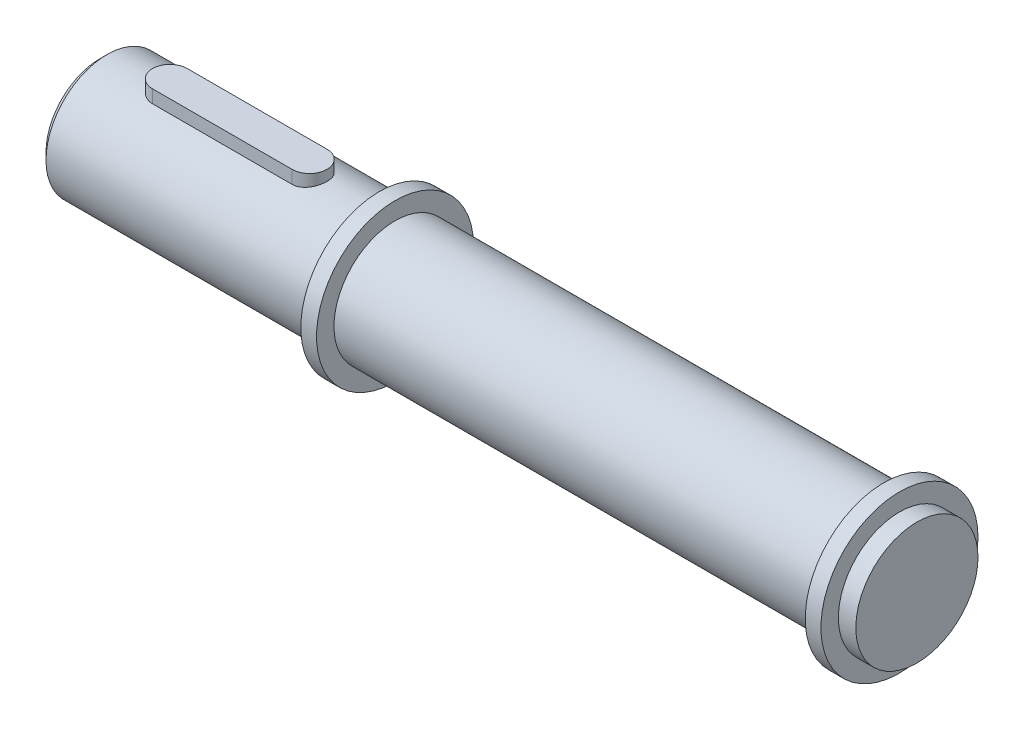
ISO-10303-21;
HEADER;
FILE_DESCRIPTION(('STEP AP214'),'2;1');
FILE_NAME('part.step','',(''),(''),'','','');
FILE_SCHEMA(('AUTOMOTIVE_DESIGN { 1 0 10303 214 1 1 1 1 }'));
ENDSEC;
DATA;
#1=APPLICATION_CONTEXT('core data for automotive mechanical design processes');
#2=APPLICATION_PROTOCOL_DEFINITION('international standard','automotive_design',2000,#1);
#3=PRODUCT_CONTEXT('',#1,'mechanical');
#4=PRODUCT('Part','Part','',(#3));
#5=PRODUCT_RELATED_PRODUCT_CATEGORY('part','',(#4));
#6=PRODUCT_DEFINITION_FORMATION('','',#4);
#7=PRODUCT_DEFINITION_CONTEXT('part definition',#1,'design');
#8=PRODUCT_DEFINITION('design','',#6,#7);
#9=PRODUCT_DEFINITION_SHAPE('','',#8);
#10=(LENGTH_UNIT() NAMED_UNIT(*) SI_UNIT(.MILLI.,.METRE.));
#11=(NAMED_UNIT(*) PLANE_ANGLE_UNIT() SI_UNIT($,.RADIAN.));
#12=(NAMED_UNIT(*) SI_UNIT($,.STERADIAN.) SOLID_ANGLE_UNIT());
#13=UNCERTAINTY_MEASURE_WITH_UNIT(LENGTH_MEASURE(1.E-05),#10,'distance_accuracy_value','');
#14=(GEOMETRIC_REPRESENTATION_CONTEXT(3) GLOBAL_UNCERTAINTY_ASSIGNED_CONTEXT((#13)) GLOBAL_UNIT_ASSIGNED_CONTEXT((#10,
#11,#12)) REPRESENTATION_CONTEXT('',''));
#15=CARTESIAN_POINT('',(0.,0.,0.));
#16=DIRECTION('',(0.,0.,1.));
#17=DIRECTION('',(1.,0.,0.));
#18=AXIS2_PLACEMENT_3D('',#15,#16,#17);
#19=CARTESIAN_POINT('',(-74.5,0.,0.));
#20=DIRECTION('',(1.,0.,0.));
#21=DIRECTION('',(0.,0.,-1.));
#22=AXIS2_PLACEMENT_3D('',#19,#20,#21);
#23=CYLINDRICAL_SURFACE('',#22,22.5);
#24=CARTESIAN_POINT('',(-74.5,0.,0.));
#25=DIRECTION('',(1.,0.,0.));
#26=DIRECTION('',(0.,0.,-1.));
#27=AXIS2_PLACEMENT_3D('',#24,#25,#26);
#28=CIRCLE('',#27,22.5);
#29=CARTESIAN_POINT('',(-74.5,0.,-22.5));
#30=VERTEX_POINT('',#29);
#31=EDGE_CURVE('E150',#30,#30,#28,.T.);
#32=ORIENTED_EDGE('',*,*,#31,.T.);
#33=EDGE_LOOP('',(#32));
#34=FACE_BOUND('',#33,.T.);
#35=CARTESIAN_POINT('',(-70.,0.,0.));
#36=DIRECTION('',(1.,0.,0.));
#37=DIRECTION('',(0.,0.,-1.));
#38=AXIS2_PLACEMENT_3D('',#35,#36,#37);
#39=CIRCLE('',#38,22.5);
#40=CARTESIAN_POINT('',(-70.,0.,-22.5));
#41=VERTEX_POINT('',#40);
#42=EDGE_CURVE('E147',#41,#41,#39,.T.);
#43=ORIENTED_EDGE('',*,*,#42,.F.);
#44=EDGE_LOOP('',(#43));
#45=FACE_BOUND('',#44,.T.);
#46=ADVANCED_FACE('F33',(#34,#45),#23,.T.);
#47=CARTESIAN_POINT('',(-74.5,22.5,0.));
#48=DIRECTION('',(-1.,0.,0.));
#49=DIRECTION('',(0.,0.,1.));
#50=AXIS2_PLACEMENT_3D('',#47,#48,#49);
#51=PLANE('',#50);
#52=CARTESIAN_POINT('',(-74.5,0.,0.));
#53=DIRECTION('',(-1.,0.,0.));
#54=DIRECTION('',(0.,0.,1.));
#55=AXIS2_PLACEMENT_3D('',#52,#53,#54);
#56=CIRCLE('',#55,17.5);
#57=CARTESIAN_POINT('',(-74.5,0.,17.5));
#58=VERTEX_POINT('',#57);
#59=EDGE_CURVE('E101',#58,#58,#56,.T.);
#60=ORIENTED_EDGE('',*,*,#59,.F.);
#61=EDGE_LOOP('',(#60));
#62=FACE_BOUND('',#61,.T.);
#63=ORIENTED_EDGE('',*,*,#31,.F.);
#64=EDGE_LOOP('',(#63));
#65=FACE_BOUND('',#64,.T.);
#66=ADVANCED_FACE('F186',(#62,#65),#51,.T.);
#67=CARTESIAN_POINT('',(74.5,0.,0.));
#68=DIRECTION('',(1.,0.,0.));
#69=DIRECTION('',(0.,0.,-1.));
#70=AXIS2_PLACEMENT_3D('',#67,#68,#69);
#71=PLANE('',#70);
#72=CARTESIAN_POINT('',(74.5,0.,0.));
#73=DIRECTION('',(1.,0.,0.));
#74=DIRECTION('',(0.,0.,-1.));
#75=AXIS2_PLACEMENT_3D('',#72,#73,#74);
#76=CIRCLE('',#75,17.5);
#77=CARTESIAN_POINT('',(74.5,0.,-17.5));
#78=VERTEX_POINT('',#77);
#79=EDGE_CURVE('E97',#78,#78,#76,.T.);
#80=ORIENTED_EDGE('',*,*,#79,.F.);
#81=EDGE_LOOP('',(#80));
#82=FACE_BOUND('',#81,.T.);
#83=CARTESIAN_POINT('',(74.5,0.,0.));
#84=DIRECTION('',(1.,0.,0.));
#85=DIRECTION('',(0.,0.,-1.));
#86=AXIS2_PLACEMENT_3D('',#83,#84,#85);
#87=CIRCLE('',#86,22.5);
#88=CARTESIAN_POINT('',(74.5,0.,-22.5));
#89=VERTEX_POINT('',#88);
#90=EDGE_CURVE('E162',#89,#89,#87,.T.);
#91=ORIENTED_EDGE('',*,*,#90,.T.);
#92=EDGE_LOOP('',(#91));
#93=FACE_BOUND('',#92,.T.);
#94=ADVANCED_FACE('F192',(#82,#93),#71,.T.);
#95=CARTESIAN_POINT('',(-74.5,0.,0.));
#96=DIRECTION('',(1.,0.,0.));
#97=DIRECTION('',(0.,0.,-1.));
#98=AXIS2_PLACEMENT_3D('',#95,#96,#97);
#99=CYLINDRICAL_SURFACE('',#98,22.5);
#100=CARTESIAN_POINT('',(70.,0.,0.));
#101=DIRECTION('',(1.,0.,0.));
#102=DIRECTION('',(0.,0.,-1.));
#103=AXIS2_PLACEMENT_3D('',#100,#101,#102);
#104=CIRCLE('',#103,22.5);
#105=CARTESIAN_POINT('',(70.,0.,-22.5));
#106=VERTEX_POINT('',#105);
#107=EDGE_CURVE('E159',#106,#106,#104,.T.);
#108=ORIENTED_EDGE('',*,*,#107,.T.);
#109=EDGE_LOOP('',(#108));
#110=FACE_BOUND('',#109,.T.);
#111=ORIENTED_EDGE('',*,*,#90,.F.);
#112=EDGE_LOOP('',(#111));
#113=FACE_BOUND('',#112,.T.);
#114=ADVANCED_FACE('F199',(#110,#113),#99,.T.);
#115=CARTESIAN_POINT('',(70.,22.5,0.));
#116=DIRECTION('',(-1.,0.,0.));
#117=DIRECTION('',(0.,0.,1.));
#118=AXIS2_PLACEMENT_3D('',#115,#116,#117);
#119=PLANE('',#118);
#120=CARTESIAN_POINT('',(70.,0.,0.));
#121=DIRECTION('',(1.,0.,0.));
#122=DIRECTION('',(0.,0.,-1.));
#123=AXIS2_PLACEMENT_3D('',#120,#121,#122);
#124=CIRCLE('',#123,17.5);
#125=CARTESIAN_POINT('',(70.,0.,-17.5));
#126=VERTEX_POINT('',#125);
#127=EDGE_CURVE('E156',#126,#126,#124,.T.);
#128=ORIENTED_EDGE('',*,*,#127,.T.);
#129=EDGE_LOOP('',(#128));
#130=FACE_BOUND('',#129,.T.);
#131=ORIENTED_EDGE('',*,*,#107,.F.);
#132=EDGE_LOOP('',(#131));
#133=FACE_BOUND('',#132,.T.);
#134=ADVANCED_FACE('F203',(#130,#133),#119,.T.);
#135=CARTESIAN_POINT('',(-74.5,0.,0.));
#136=DIRECTION('',(1.,0.,0.));
#137=DIRECTION('',(0.,0.,-1.));
#138=AXIS2_PLACEMENT_3D('',#135,#136,#137);
#139=CYLINDRICAL_SURFACE('',#138,17.5);
#140=CARTESIAN_POINT('',(-70.,0.,0.));
#141=DIRECTION('',(1.,0.,0.));
#142=DIRECTION('',(0.,0.,-1.));
#143=AXIS2_PLACEMENT_3D('',#140,#141,#142);
#144=CIRCLE('',#143,17.5);
#145=CARTESIAN_POINT('',(-70.,0.,-17.5));
#146=VERTEX_POINT('',#145);
#147=EDGE_CURVE('E153',#146,#146,#144,.T.);
#148=ORIENTED_EDGE('',*,*,#147,.T.);
#149=EDGE_LOOP('',(#148));
#150=FACE_BOUND('',#149,.T.);
#151=ORIENTED_EDGE('',*,*,#127,.F.);
#152=EDGE_LOOP('',(#151));
#153=FACE_BOUND('',#152,.T.);
#154=ADVANCED_FACE('F207',(#150,#153),#139,.T.);
#155=CARTESIAN_POINT('',(-70.,17.5,0.));
#156=DIRECTION('',(1.,0.,0.));
#157=DIRECTION('',(0.,0.,-1.));
#158=AXIS2_PLACEMENT_3D('',#155,#156,#157);
#159=PLANE('',#158);
#160=ORIENTED_EDGE('',*,*,#42,.T.);
#161=EDGE_LOOP('',(#160));
#162=FACE_BOUND('',#161,.T.);
#163=ORIENTED_EDGE('',*,*,#147,.F.);
#164=EDGE_LOOP('',(#163));
#165=FACE_BOUND('',#164,.T.);
#166=ADVANCED_FACE('F211',(#162,#165),#159,.T.);
#167=CARTESIAN_POINT('',(-154.5,0.,0.));
#168=DIRECTION('',(1.,0.,0.));
#169=DIRECTION('',(0.,0.,-1.));
#170=AXIS2_PLACEMENT_3D('',#167,#168,#169);
#171=CYLINDRICAL_SURFACE('',#170,17.5);
#172=CARTESIAN_POINT('',(-152.499999999995,0.,0.));
#173=DIRECTION('',(-1.,0.,0.));
#174=DIRECTION('',(0.,0.,1.));
#175=AXIS2_PLACEMENT_3D('',#172,#173,#174);
#176=CIRCLE('',#175,17.5);
#177=CARTESIAN_POINT('',(-152.499999999995,0.,17.5));
#178=VERTEX_POINT('',#177);
#179=EDGE_CURVE('E11',#178,#178,#176,.F.);
#180=ORIENTED_EDGE('',*,*,#179,.T.);
#181=EDGE_LOOP('',(#180));
#182=FACE_BOUND('',#181,.T.);
#183=DIRECTION('',(1.,0.,0.));
#184=VECTOR('',#183,1.);
#185=CARTESIAN_POINT('',(-154.5,16.7705098312484,5.));
#186=LINE('',#185,#184);
#187=CARTESIAN_POINT('',(-134.5,16.7705098312467,5.));
#188=VERTEX_POINT('',#187);
#189=CARTESIAN_POINT('',(-94.5,16.7705098312484,5.));
#190=VERTEX_POINT('',#189);
#191=EDGE_CURVE('E129',#188,#190,#186,.T.);
#192=ORIENTED_EDGE('',*,*,#191,.F.);
#193=CARTESIAN_POINT('',(-134.5,16.7705098312484,-5.));
#194=CARTESIAN_POINT('',(-134.637543766947,16.7704912725158,-5.00001814544053));
#195=CARTESIAN_POINT('',(-134.775080622023,16.7722013219269,-4.99432529208164));
#196=CARTESIAN_POINT('',(-135.049111189284,16.7789431019967,-4.97165222541634));
#197=CARTESIAN_POINT('',(-135.185605111843,16.7839741438635,-4.95467435267923));
#198=CARTESIAN_POINT('',(-135.456258454019,16.7972068372471,-4.90961903685605));
#199=CARTESIAN_POINT('',(-135.590422624833,16.8054009743523,-4.8815678964473));
#200=CARTESIAN_POINT('',(-135.855799641989,16.8247046364186,-4.81461674604718));
#201=CARTESIAN_POINT('',(-135.987012422422,16.8358142264156,-4.77571649404059));
#202=CARTESIAN_POINT('',(-136.245531660622,16.8606149796878,-4.68740449021954));
#203=CARTESIAN_POINT('',(-136.372840055364,16.874304837985,-4.63799805032665));
#204=CARTESIAN_POINT('',(-136.622799362726,16.9038705765848,-4.5290552200171));
#205=CARTESIAN_POINT('',(-136.745448523371,16.9197472690052,-4.46951506432956));
#206=CARTESIAN_POINT('',(-137.105208360307,16.9699997678901,-4.27631278448766));
#207=CARTESIAN_POINT('',(-137.334298361895,17.007014905076,-4.12801150136262));
#208=CARTESIAN_POINT('',(-137.770513964869,17.0850471293107,-3.79229915782692));
#209=CARTESIAN_POINT('',(-137.976920274657,17.1261428352533,-3.60397767000145));
#210=CARTESIAN_POINT('',(-138.355737693074,17.2070462516998,-3.19544341696383));
#211=CARTESIAN_POINT('',(-138.528143164041,17.2468537476932,-2.97522537348192));
#212=CARTESIAN_POINT('',(-138.837078091968,17.3215844019062,-2.50410851659381));
#213=CARTESIAN_POINT('',(-138.972880924298,17.3564029869975,-2.25271539483175));
#214=CARTESIAN_POINT('',(-139.200007712392,17.4163145657263,-1.72950937060038));
#215=CARTESIAN_POINT('',(-139.291342305188,17.4414098849257,-1.45770136944962));
#216=CARTESIAN_POINT('',(-139.424585700851,17.4784878135792,-0.908899275051315));
#217=CARTESIAN_POINT('',(-139.46772185459,17.4907954521753,-0.632225504452082));
#218=CARTESIAN_POINT('',(-139.507216694155,17.5020523750682,-0.0753060921048481));
#219=CARTESIAN_POINT('',(-139.503583330996,17.5010039299559,0.204938934421961));
#220=CARTESIAN_POINT('',(-139.450484519806,17.4859002467781,0.7524513735302));
#221=CARTESIAN_POINT('',(-139.402347600726,17.4722220494947,1.01985970934148));
#222=CARTESIAN_POINT('',(-139.263759170452,17.433846479088,1.5426351469282));
#223=CARTESIAN_POINT('',(-139.17330552299,17.4091485496606,1.79800164008104));
#224=CARTESIAN_POINT('',(-138.951733628734,17.3509771517082,2.29267928834746));
#225=CARTESIAN_POINT('',(-138.820181047918,17.3174105731756,2.53178407311226));
#226=CARTESIAN_POINT('',(-138.520355666425,17.2450626129451,2.98504901208546));
#227=CARTESIAN_POINT('',(-138.352075412724,17.2062801734237,3.19920408978385));
#228=CARTESIAN_POINT('',(-138.072372641175,17.1465202223136,3.50113424709604));
#229=CARTESIAN_POINT('',(-137.972636135654,17.1259700648702,3.60007423743549));
#230=CARTESIAN_POINT('',(-137.76517975766,17.0851123940087,3.7892313461309));
#231=CARTESIAN_POINT('',(-137.65746266013,17.0648047990745,3.87945147156873));
#232=CARTESIAN_POINT('',(-137.434654959007,17.0249868857383,4.05062437518906));
#233=CARTESIAN_POINT('',(-137.319559470128,17.005477109874,4.13157091233147));
#234=CARTESIAN_POINT('',(-137.082839206299,16.9678346429649,4.28353981460234));
#235=CARTESIAN_POINT('',(-136.961216996666,16.9497014175386,4.35456603991597));
#236=CARTESIAN_POINT('',(-136.711084048682,16.9151829895462,4.48679157824972));
#237=CARTESIAN_POINT('',(-136.582521372203,16.898814896638,4.54789718496758));
#238=CARTESIAN_POINT('',(-136.32045850364,16.8685251216221,4.65898872141543));
#239=CARTESIAN_POINT('',(-136.186960342239,16.8546024466245,4.70897916633161));
#240=CARTESIAN_POINT('',(-135.916078988644,16.829649854127,4.79739484975373));
#241=CARTESIAN_POINT('',(-135.778700020741,16.8186169160755,4.835832170633));
#242=CARTESIAN_POINT('',(-135.501004454348,16.7997865631929,4.90084834749728));
#243=CARTESIAN_POINT('',(-135.360689248481,16.7919876494693,4.92743269748004));
#244=CARTESIAN_POINT('',(-135.100334885787,16.7808301521248,4.96528740578586));
#245=CARTESIAN_POINT('',(-134.980568370272,16.776966894118,4.97830600651658));
#246=CARTESIAN_POINT('',(-134.740537705184,16.7718034889731,4.99566040544727));
#247=CARTESIAN_POINT('',(-134.620274596223,16.7704994326599,5.00000944654161));
#248=CARTESIAN_POINT('',(-134.5,16.7705098312484,5.));
#249=B_SPLINE_CURVE_WITH_KNOTS('',3,(#193,#194,#195,#196,#197,#198,#199,#200,#201,#202,#203,
#204,#205,#206,#207,#208,#209,#210,#211,#212,#213,#214,#215,#216,#217,#218,#219,#220,#221,#222,
#223,#224,#225,#226,#227,#228,#229,#230,#231,#232,#233,#234,#235,#236,#237,#238,#239,#240,#241,
#242,#243,#244,#245,#246,#247,#248),.UNSPECIFIED.,.F.,.F.,(4,2,2,2,2,2,2,2,2,2,2,2,2,2,2,2,2,2,
2,2,2,2,2,2,2,2,2,4),(0.,0.41249217880454,0.824898831357961,1.2363317198125,1.64777378699038,
2.05900832185037,2.47039598941258,3.29264569343989,4.13611232627187,4.97971869650209,
5.83900986868946,6.69809539287325,7.53476732988531,8.37129703101928,9.18363381655587,
9.99601161556284,10.8172828992968,11.6387209961027,12.0642579015972,12.489647531354,
12.9153217832843,13.3408299328975,13.7701489130554,14.1992931759112,14.6279870611799,
15.056482034464,15.4177510461265,15.7784677892953),.UNSPECIFIED.);
#250=CARTESIAN_POINT('',(-134.5,16.7705098312467,-5.));
#251=VERTEX_POINT('',#250);
#252=EDGE_CURVE('E56',#251,#188,#249,.T.);
#253=ORIENTED_EDGE('',*,*,#252,.F.);
#254=DIRECTION('',(1.,0.,0.));
#255=VECTOR('',#254,1.);
#256=CARTESIAN_POINT('',(-154.5,16.7705098312484,-5.));
#257=LINE('',#256,#255);
#258=CARTESIAN_POINT('',(-94.5,16.7705098312484,-5.));
#259=VERTEX_POINT('',#258);
#260=EDGE_CURVE('E120',#259,#251,#257,.F.);
#261=ORIENTED_EDGE('',*,*,#260,.F.);
#262=CARTESIAN_POINT('',(-94.5,16.7705098312484,5.));
#263=CARTESIAN_POINT('',(-94.3624562330531,16.7704912725158,5.00001814544053));
#264=CARTESIAN_POINT('',(-94.2249193779771,16.7722013219269,4.99432529208164));
#265=CARTESIAN_POINT('',(-93.9508888107155,16.7789431019967,4.97165222541634));
#266=CARTESIAN_POINT('',(-93.8143948881572,16.7839741438635,4.95467435267923));
#267=CARTESIAN_POINT('',(-93.5437415459805,16.7972068372471,4.90961903685605));
#268=CARTESIAN_POINT('',(-93.4095773751666,16.8054009743523,4.88156789644729));
#269=CARTESIAN_POINT('',(-93.1442003580112,16.8247046364186,4.81461674604718));
#270=CARTESIAN_POINT('',(-93.012987577578,16.8358142264156,4.77571649404058));
#271=CARTESIAN_POINT('',(-92.7544683393777,16.8606149796878,4.68740449021953));
#272=CARTESIAN_POINT('',(-92.6271599446359,16.874304837985,4.63799805032664));
#273=CARTESIAN_POINT('',(-92.3772006372743,16.9038705765848,4.52905522001708));
#274=CARTESIAN_POINT('',(-92.2545514766285,16.9197472690052,4.46951506432954));
#275=CARTESIAN_POINT('',(-91.894791639693,16.9699997678901,4.27631278448764));
#276=CARTESIAN_POINT('',(-91.6657016381045,17.007014905076,4.12801150136261));
#277=CARTESIAN_POINT('',(-91.2294860351306,17.0850471293107,3.79229915782691));
#278=CARTESIAN_POINT('',(-91.023079725343,17.1261428352533,3.60397767000144));
#279=CARTESIAN_POINT('',(-90.6442623069264,17.2070462516998,3.19544341696382));
#280=CARTESIAN_POINT('',(-90.471856835959,17.2468537476932,2.97522537348191));
#281=CARTESIAN_POINT('',(-90.1629219080325,17.3215844019063,2.5041085165938));
#282=CARTESIAN_POINT('',(-90.0271190757015,17.3564029869975,2.25271539483174));
#283=CARTESIAN_POINT('',(-89.7999922876077,17.4163145657263,1.72950937060037));
#284=CARTESIAN_POINT('',(-89.7086576948119,17.4414098849257,1.45770136944961));
#285=CARTESIAN_POINT('',(-89.5754142991493,17.4784878135793,0.908899275051307));
#286=CARTESIAN_POINT('',(-89.5322781454103,17.4907954521753,0.632225504452075));
#287=CARTESIAN_POINT('',(-89.4927833058454,17.5020523750682,0.0753060921048373));
#288=CARTESIAN_POINT('',(-89.4964166690043,17.5010039299558,-0.204938934421976));
#289=CARTESIAN_POINT('',(-89.5495154801944,17.4859002467781,-0.752451373530218));
#290=CARTESIAN_POINT('',(-89.5976523992742,17.4722220494947,-1.0198597093415));
#291=CARTESIAN_POINT('',(-89.7362408295484,17.433846479088,-1.54263514692821));
#292=CARTESIAN_POINT('',(-89.8266944770104,17.4091485496606,-1.79800164008106));
#293=CARTESIAN_POINT('',(-90.0482663712656,17.3509771517082,-2.29267928834748));
#294=CARTESIAN_POINT('',(-90.1798189520825,17.3174105731756,-2.53178407311227));
#295=CARTESIAN_POINT('',(-90.4796443335755,17.2450626129451,-2.98504901208547));
#296=CARTESIAN_POINT('',(-90.6479245872765,17.2062801734237,-3.19920408978386));
#297=CARTESIAN_POINT('',(-90.9276273588245,17.1465202223136,-3.50113424709606));
#298=CARTESIAN_POINT('',(-91.0273638643464,17.1259700648702,-3.60007423743551));
#299=CARTESIAN_POINT('',(-91.2348202423399,17.0851123940087,-3.7892313461309));
#300=CARTESIAN_POINT('',(-91.3425373398701,17.0648047990745,-3.87945147156872));
#301=CARTESIAN_POINT('',(-91.5653450409931,17.0249868857383,-4.05062437518905));
#302=CARTESIAN_POINT('',(-91.6804405298721,17.005477109874,-4.13157091233147));
#303=CARTESIAN_POINT('',(-91.9171607937009,16.9678346429649,-4.28353981460234));
#304=CARTESIAN_POINT('',(-92.0387830033338,16.9497014175386,-4.35456603991597));
#305=CARTESIAN_POINT('',(-92.2889159513182,16.9151829895461,-4.48679157824972));
#306=CARTESIAN_POINT('',(-92.4174786277971,16.898814896638,-4.5478971849676));
#307=CARTESIAN_POINT('',(-92.67954149636,16.8685251216221,-4.65898872141545));
#308=CARTESIAN_POINT('',(-92.8130396577613,16.8546024466245,-4.70897916633163));
#309=CARTESIAN_POINT('',(-93.0839210113563,16.829649854127,-4.79739484975374));
#310=CARTESIAN_POINT('',(-93.2212999792591,16.8186169160755,-4.83583217063301));
#311=CARTESIAN_POINT('',(-93.4989955456524,16.7997865631929,-4.90084834749729));
#312=CARTESIAN_POINT('',(-93.6393107515193,16.7919876494693,-4.92743269748005));
#313=CARTESIAN_POINT('',(-93.8996651142126,16.7808301521248,-4.96528740578587));
#314=CARTESIAN_POINT('',(-94.0194316297284,16.776966894118,-4.97830600651658));
#315=CARTESIAN_POINT('',(-94.2594622948156,16.7718034889731,-4.99566040544728));
#316=CARTESIAN_POINT('',(-94.379725403777,16.7704994326599,-5.00000944654161));
#317=CARTESIAN_POINT('',(-94.5,16.7705098312484,-5.));
#318=B_SPLINE_CURVE_WITH_KNOTS('',3,(#262,#263,#264,#265,#266,#267,#268,#269,#270,#271,#272,
#273,#274,#275,#276,#277,#278,#279,#280,#281,#282,#283,#284,#285,#286,#287,#288,#289,#290,#291,
#292,#293,#294,#295,#296,#297,#298,#299,#300,#301,#302,#303,#304,#305,#306,#307,#308,#309,#310,
#311,#312,#313,#314,#315,#316,#317),.UNSPECIFIED.,.F.,.F.,(4,2,2,2,2,2,2,2,2,2,2,2,2,2,2,2,2,2,
2,2,2,2,2,2,2,2,2,4),(0.,0.412492178804554,0.824898831357989,1.23633171981253,1.64777378699039,
2.05900832185038,2.47039598941263,3.29264569343992,4.13611232627188,4.9797186965021,
5.83900986868948,6.69809539287325,7.53476732988531,8.3712970310193,9.18363381655588,
9.99601161556284,10.8172828992968,11.6387209961027,12.0642579015972,12.489647531354,
12.9153217832843,13.3408299328975,13.7701489130555,14.1992931759112,14.6279870611799,
15.056482034464,15.4177510461265,15.7784677892953),.UNSPECIFIED.);
#319=EDGE_CURVE('E122',#190,#259,#318,.T.);
#320=ORIENTED_EDGE('',*,*,#319,.F.);
#321=EDGE_LOOP('',(#192,#253,#261,#320));
#322=FACE_BOUND('',#321,.T.);
#323=ORIENTED_EDGE('',*,*,#59,.T.);
#324=EDGE_LOOP('',(#323));
#325=FACE_BOUND('',#324,.T.);
#326=ADVANCED_FACE('F214',(#182,#322,#325),#171,.T.);
#327=CARTESIAN_POINT('',(-154.5,0.,0.));
#328=DIRECTION('',(-1.,0.,0.));
#329=DIRECTION('',(0.,0.,1.));
#330=AXIS2_PLACEMENT_3D('',#327,#328,#329);
#331=PLANE('',#330);
#332=CARTESIAN_POINT('',(-154.5,0.,0.));
#333=DIRECTION('',(-1.,0.,0.));
#334=DIRECTION('',(0.,0.,1.));
#335=AXIS2_PLACEMENT_3D('',#332,#333,#334);
#336=CIRCLE('',#335,15.5000000000051);
#337=CARTESIAN_POINT('',(-154.5,0.,15.5000000000051));
#338=VERTEX_POINT('',#337);
#339=EDGE_CURVE('E41',#338,#338,#336,.T.);
#340=ORIENTED_EDGE('',*,*,#339,.T.);
#341=EDGE_LOOP('',(#340));
#342=FACE_BOUND('',#341,.T.);
#343=CARTESIAN_POINT('',(-154.5,0.,0.));
#344=DIRECTION('',(-1.,0.,0.));
#345=DIRECTION('',(0.,0.,1.));
#346=AXIS2_PLACEMENT_3D('',#343,#344,#345);
#347=CIRCLE('',#346,9.05000000000644);
#348=CARTESIAN_POINT('',(-154.5,0.,9.05000000000644));
#349=VERTEX_POINT('',#348);
#350=EDGE_CURVE('E169',#349,#349,#347,.F.);
#351=ORIENTED_EDGE('',*,*,#350,.T.);
#352=EDGE_LOOP('',(#351));
#353=FACE_BOUND('',#352,.T.);
#354=ADVANCED_FACE('F140',(#342,#353),#331,.T.);
#355=CARTESIAN_POINT('',(-134.5,-500000.,0.));
#356=DIRECTION('',(0.,1.,0.));
#357=DIRECTION('',(0.,0.,1.));
#358=AXIS2_PLACEMENT_3D('',#355,#356,#357);
#359=CYLINDRICAL_SURFACE('',#358,5.);
#360=DIRECTION('',(0.,1.,0.));
#361=VECTOR('',#360,1.);
#362=CARTESIAN_POINT('',(-134.5,-500000.,-5.));
#363=LINE('',#362,#361);
#364=CARTESIAN_POINT('',(-134.5,20.5,-5.));
#365=VERTEX_POINT('',#364);
#366=EDGE_CURVE('E111',#251,#365,#363,.T.);
#367=ORIENTED_EDGE('',*,*,#366,.F.);
#368=ORIENTED_EDGE('',*,*,#252,.T.);
#369=DIRECTION('',(0.,1.,0.));
#370=VECTOR('',#369,1.);
#371=CARTESIAN_POINT('',(-134.5,-500000.,5.));
#372=LINE('',#371,#370);
#373=CARTESIAN_POINT('',(-134.5,20.5,5.));
#374=VERTEX_POINT('',#373);
#375=EDGE_CURVE('E118',#188,#374,#372,.T.);
#376=ORIENTED_EDGE('',*,*,#375,.T.);
#377=CARTESIAN_POINT('',(-134.5,20.5,0.));
#378=DIRECTION('',(0.,1.,0.));
#379=DIRECTION('',(0.,0.,1.));
#380=AXIS2_PLACEMENT_3D('',#377,#378,#379);
#381=CIRCLE('',#380,5.);
#382=EDGE_CURVE('E90',#365,#374,#381,.T.);
#383=ORIENTED_EDGE('',*,*,#382,.F.);
#384=EDGE_LOOP('',(#367,#368,#376,#383));
#385=FACE_BOUND('',#384,.T.);
#386=ADVANCED_FACE('F138',(#385),#359,.T.);
#387=CARTESIAN_POINT('',(-134.5,-500000.,5.));
#388=DIRECTION('',(0.,0.,1.));
#389=DIRECTION('',(1.,0.,0.));
#390=AXIS2_PLACEMENT_3D('',#387,#388,#389);
#391=PLANE('',#390);
#392=ORIENTED_EDGE('',*,*,#375,.F.);
#393=ORIENTED_EDGE('',*,*,#191,.T.);
#394=DIRECTION('',(0.,1.,0.));
#395=VECTOR('',#394,1.);
#396=CARTESIAN_POINT('',(-94.5,-500000.,5.));
#397=LINE('',#396,#395);
#398=CARTESIAN_POINT('',(-94.5,20.5,5.));
#399=VERTEX_POINT('',#398);
#400=EDGE_CURVE('E116',#190,#399,#397,.T.);
#401=ORIENTED_EDGE('',*,*,#400,.T.);
#402=DIRECTION('',(1.,0.,0.));
#403=VECTOR('',#402,1.);
#404=CARTESIAN_POINT('',(-134.5,20.5,5.));
#405=LINE('',#404,#403);
#406=EDGE_CURVE('E102',#374,#399,#405,.T.);
#407=ORIENTED_EDGE('',*,*,#406,.F.);
#408=EDGE_LOOP('',(#392,#393,#401,#407));
#409=FACE_BOUND('',#408,.T.);
#410=ADVANCED_FACE('F232',(#409),#391,.T.);
#411=CARTESIAN_POINT('',(-94.5,-500000.,0.));
#412=DIRECTION('',(0.,1.,0.));
#413=DIRECTION('',(0.,0.,1.));
#414=AXIS2_PLACEMENT_3D('',#411,#412,#413);
#415=CYLINDRICAL_SURFACE('',#414,5.);
#416=ORIENTED_EDGE('',*,*,#400,.F.);
#417=ORIENTED_EDGE('',*,*,#319,.T.);
#418=DIRECTION('',(0.,1.,0.));
#419=VECTOR('',#418,1.);
#420=CARTESIAN_POINT('',(-94.5,-500000.,-5.));
#421=LINE('',#420,#419);
#422=CARTESIAN_POINT('',(-94.5,20.5,-5.));
#423=VERTEX_POINT('',#422);
#424=EDGE_CURVE('E48',#259,#423,#421,.T.);
#425=ORIENTED_EDGE('',*,*,#424,.T.);
#426=CARTESIAN_POINT('',(-94.5,20.5,0.));
#427=DIRECTION('',(0.,1.,0.));
#428=DIRECTION('',(0.,0.,1.));
#429=AXIS2_PLACEMENT_3D('',#426,#427,#428);
#430=CIRCLE('',#429,5.);
#431=EDGE_CURVE('E105',#399,#423,#430,.T.);
#432=ORIENTED_EDGE('',*,*,#431,.F.);
#433=EDGE_LOOP('',(#416,#417,#425,#432));
#434=FACE_BOUND('',#433,.T.);
#435=ADVANCED_FACE('F131',(#434),#415,.T.);
#436=CARTESIAN_POINT('',(-94.5,-500000.,-5.));
#437=DIRECTION('',(0.,0.,-1.));
#438=DIRECTION('',(-1.,0.,0.));
#439=AXIS2_PLACEMENT_3D('',#436,#437,#438);
#440=PLANE('',#439);
#441=ORIENTED_EDGE('',*,*,#424,.F.);
#442=ORIENTED_EDGE('',*,*,#260,.T.);
#443=ORIENTED_EDGE('',*,*,#366,.T.);
#444=DIRECTION('',(-1.,0.,0.));
#445=VECTOR('',#444,1.);
#446=CARTESIAN_POINT('',(-94.5,20.5,-5.));
#447=LINE('',#446,#445);
#448=EDGE_CURVE('E108',#423,#365,#447,.T.);
#449=ORIENTED_EDGE('',*,*,#448,.F.);
#450=EDGE_LOOP('',(#441,#442,#443,#449));
#451=FACE_BOUND('',#450,.T.);
#452=ADVANCED_FACE('F238',(#451),#440,.T.);
#453=CARTESIAN_POINT('',(-134.5,20.5,0.));
#454=DIRECTION('',(0.,1.,0.));
#455=DIRECTION('',(0.,0.,1.));
#456=AXIS2_PLACEMENT_3D('',#453,#454,#455);
#457=PLANE('',#456);
#458=ORIENTED_EDGE('',*,*,#382,.T.);
#459=ORIENTED_EDGE('',*,*,#406,.T.);
#460=ORIENTED_EDGE('',*,*,#431,.T.);
#461=ORIENTED_EDGE('',*,*,#448,.T.);
#462=EDGE_LOOP('',(#458,#459,#460,#461));
#463=FACE_BOUND('',#462,.T.);
#464=ADVANCED_FACE('F221',(#463),#457,.T.);
#465=CARTESIAN_POINT('',(79.5,0.,0.));
#466=DIRECTION('',(-1.,0.,0.));
#467=DIRECTION('',(0.,0.,1.));
#468=AXIS2_PLACEMENT_3D('',#465,#466,#467);
#469=CYLINDRICAL_SURFACE('',#468,17.5);
#470=CARTESIAN_POINT('',(79.5,0.,0.));
#471=DIRECTION('',(1.,0.,0.));
#472=DIRECTION('',(0.,0.,-1.));
#473=AXIS2_PLACEMENT_3D('',#470,#471,#472);
#474=CIRCLE('',#473,17.5);
#475=CARTESIAN_POINT('',(79.5,0.,-17.5));
#476=VERTEX_POINT('',#475);
#477=EDGE_CURVE('E86',#476,#476,#474,.T.);
#478=ORIENTED_EDGE('',*,*,#477,.F.);
#479=EDGE_LOOP('',(#478));
#480=FACE_BOUND('',#479,.T.);
#481=ORIENTED_EDGE('',*,*,#79,.T.);
#482=EDGE_LOOP('',(#481));
#483=FACE_BOUND('',#482,.T.);
#484=ADVANCED_FACE('F244',(#480,#483),#469,.T.);
#485=CARTESIAN_POINT('',(79.5,0.,0.));
#486=DIRECTION('',(1.,0.,0.));
#487=DIRECTION('',(0.,0.,-1.));
#488=AXIS2_PLACEMENT_3D('',#485,#486,#487);
#489=PLANE('',#488);
#490=ORIENTED_EDGE('',*,*,#477,.T.);
#491=EDGE_LOOP('',(#490));
#492=FACE_BOUND('',#491,.T.);
#493=ADVANCED_FACE('F80',(#492),#489,.T.);
#494=CARTESIAN_POINT('',(-117.,0.,0.));
#495=DIRECTION('',(-1.,0.,0.));
#496=DIRECTION('',(0.,0.,1.));
#497=AXIS2_PLACEMENT_3D('',#494,#495,#496);
#498=CONICAL_SURFACE('',#497,5.05300000000002,1.04719755120589);
#499=CARTESIAN_POINT('',(-114.082649089847,0.,0.));
#500=VERTEX_POINT('',#499);
#501=VERTEX_LOOP('',#500);
#502=FACE_BOUND('',#501,.T.);
#503=CARTESIAN_POINT('',(-117.,0.,0.));
#504=DIRECTION('',(-1.,0.,0.));
#505=DIRECTION('',(0.,0.,1.));
#506=AXIS2_PLACEMENT_3D('',#503,#504,#505);
#507=CIRCLE('',#506,5.05300000000002);
#508=CARTESIAN_POINT('',(-117.,0.,5.05300000000002));
#509=VERTEX_POINT('',#508);
#510=EDGE_CURVE('E84',#509,#509,#507,.T.);
#511=ORIENTED_EDGE('',*,*,#510,.T.);
#512=EDGE_LOOP('',(#511));
#513=FACE_BOUND('',#512,.T.);
#514=ADVANCED_FACE('F76',(#502,#513),#498,.F.);
#515=CARTESIAN_POINT('',(-154.5,0.,0.));
#516=DIRECTION('',(-1.,0.,0.));
#517=DIRECTION('',(0.,0.,1.));
#518=AXIS2_PLACEMENT_3D('',#515,#516,#517);
#519=CYLINDRICAL_SURFACE('',#518,5.05300000000002);
#520=ORIENTED_EDGE('',*,*,#510,.F.);
#521=EDGE_LOOP('',(#520));
#522=FACE_BOUND('',#521,.T.);
#523=CARTESIAN_POINT('',(-145.,0.,0.));
#524=DIRECTION('',(-1.,0.,0.));
#525=DIRECTION('',(0.,0.,1.));
#526=AXIS2_PLACEMENT_3D('',#523,#524,#525);
#527=CIRCLE('',#526,5.05300000000002);
#528=CARTESIAN_POINT('',(-145.,0.,5.05300000000002));
#529=VERTEX_POINT('',#528);
#530=EDGE_CURVE('E87',#529,#529,#527,.T.);
#531=ORIENTED_EDGE('',*,*,#530,.T.);
#532=EDGE_LOOP('',(#531));
#533=FACE_BOUND('',#532,.T.);
#534=ADVANCED_FACE('F79',(#522,#533),#519,.F.);
#535=CARTESIAN_POINT('',(-145.,5.05300000000004,0.));
#536=DIRECTION('',(1.,0.,0.));
#537=DIRECTION('',(0.,0.,-1.));
#538=AXIS2_PLACEMENT_3D('',#535,#536,#537);
#539=PLANE('',#538);
#540=ORIENTED_EDGE('',*,*,#530,.F.);
#541=EDGE_LOOP('',(#540));
#542=FACE_BOUND('',#541,.T.);
#543=CARTESIAN_POINT('',(-145.,0.,0.));
#544=DIRECTION('',(-1.,0.,0.));
#545=DIRECTION('',(0.,0.,1.));
#546=AXIS2_PLACEMENT_3D('',#543,#544,#545);
#547=CIRCLE('',#546,6.50000000000002);
#548=CARTESIAN_POINT('',(-145.,0.,6.50000000000002));
#549=VERTEX_POINT('',#548);
#550=EDGE_CURVE('E93',#549,#549,#547,.T.);
#551=ORIENTED_EDGE('',*,*,#550,.T.);
#552=EDGE_LOOP('',(#551));
#553=FACE_BOUND('',#552,.T.);
#554=ADVANCED_FACE('F255',(#542,#553),#539,.F.);
#555=CARTESIAN_POINT('',(-154.5,0.,0.));
#556=DIRECTION('',(-1.,0.,0.));
#557=DIRECTION('',(0.,0.,1.));
#558=AXIS2_PLACEMENT_3D('',#555,#556,#557);
#559=CYLINDRICAL_SURFACE('',#558,6.50000000000002);
#560=CARTESIAN_POINT('',(-151.950000000007,0.,0.));
#561=DIRECTION('',(-1.,0.,0.));
#562=DIRECTION('',(0.,0.,1.));
#563=AXIS2_PLACEMENT_3D('',#560,#561,#562);
#564=CIRCLE('',#563,6.50000000000002);
#565=CARTESIAN_POINT('',(-151.950000000007,0.,6.50000000000002));
#566=VERTEX_POINT('',#565);
#567=EDGE_CURVE('E100',#566,#566,#564,.T.);
#568=ORIENTED_EDGE('',*,*,#567,.T.);
#569=EDGE_LOOP('',(#568));
#570=FACE_BOUND('',#569,.T.);
#571=ORIENTED_EDGE('',*,*,#550,.F.);
#572=EDGE_LOOP('',(#571));
#573=FACE_BOUND('',#572,.T.);
#574=ADVANCED_FACE('F182',(#570,#573),#559,.F.);
#575=CARTESIAN_POINT('',(-151.950000000007,0.,0.));
#576=DIRECTION('',(-1.,0.,0.));
#577=DIRECTION('',(0.,0.,1.));
#578=AXIS2_PLACEMENT_3D('',#575,#576,#577);
#579=CONICAL_SURFACE('',#578,6.50000000000002,0.785398163400003);
#580=ORIENTED_EDGE('',*,*,#350,.F.);
#581=EDGE_LOOP('',(#580));
#582=FACE_BOUND('',#581,.T.);
#583=ORIENTED_EDGE('',*,*,#567,.F.);
#584=EDGE_LOOP('',(#583));
#585=FACE_BOUND('',#584,.T.);
#586=ADVANCED_FACE('F177',(#582,#585),#579,.F.);
#587=CARTESIAN_POINT('',(-154.5,0.,0.));
#588=DIRECTION('',(1.,0.,0.));
#589=DIRECTION('',(0.,0.,-1.));
#590=AXIS2_PLACEMENT_3D('',#587,#588,#589);
#591=CONICAL_SURFACE('',#590,15.5000000000051,0.785398163394898);
#592=ORIENTED_EDGE('',*,*,#179,.F.);
#593=EDGE_LOOP('',(#592));
#594=FACE_BOUND('',#593,.T.);
#595=ORIENTED_EDGE('',*,*,#339,.F.);
#596=EDGE_LOOP('',(#595));
#597=FACE_BOUND('',#596,.T.);
#598=ADVANCED_FACE('F35',(#594,#597),#591,.T.);
#599=CLOSED_SHELL('',(#46,#66,#94,#114,#134,#154,#166,#326,#354,#386,#410,#435,#452,#464,#484,
#493,#514,#534,#554,#574,#586,#598));
#600=MANIFOLD_SOLID_BREP('B2',#599);
#601=ADVANCED_BREP_SHAPE_REPRESENTATION('',(#18,#600),#14);
#602=SHAPE_DEFINITION_REPRESENTATION(#9,#601);
ENDSEC;
END-ISO-10303-21;
